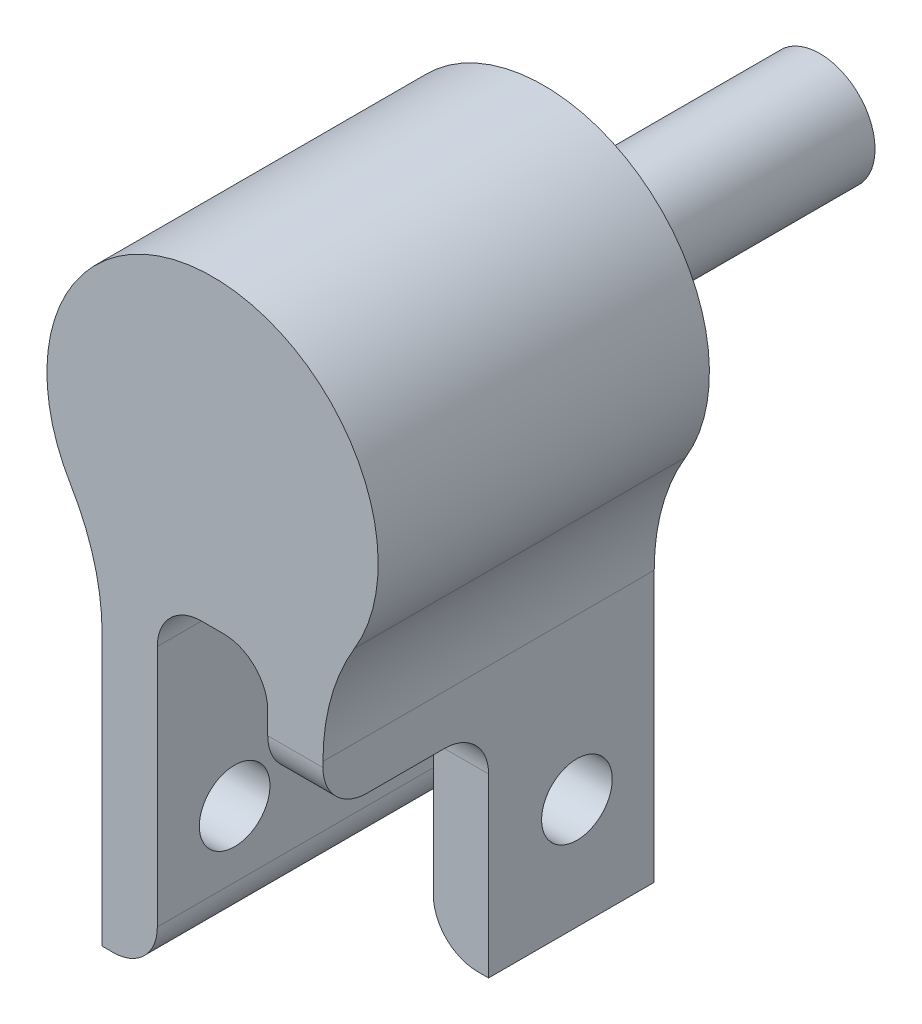
ISO-10303-21;
HEADER;
FILE_DESCRIPTION(('STEP AP214'),'2;1');
FILE_NAME('part.step','',(''),(''),'','','');
FILE_SCHEMA(('AUTOMOTIVE_DESIGN { 1 0 10303 214 1 1 1 1 }'));
ENDSEC;
DATA;
#1=APPLICATION_CONTEXT('core data for automotive mechanical design processes');
#2=APPLICATION_PROTOCOL_DEFINITION('international standard','automotive_design',2000,#1);
#3=PRODUCT_CONTEXT('',#1,'mechanical');
#4=PRODUCT('Part','Part','',(#3));
#5=PRODUCT_RELATED_PRODUCT_CATEGORY('part','',(#4));
#6=PRODUCT_DEFINITION_FORMATION('','',#4);
#7=PRODUCT_DEFINITION_CONTEXT('part definition',#1,'design');
#8=PRODUCT_DEFINITION('design','',#6,#7);
#9=PRODUCT_DEFINITION_SHAPE('','',#8);
#10=(LENGTH_UNIT() NAMED_UNIT(*) SI_UNIT(.MILLI.,.METRE.));
#11=(NAMED_UNIT(*) PLANE_ANGLE_UNIT() SI_UNIT($,.RADIAN.));
#12=(NAMED_UNIT(*) SI_UNIT($,.STERADIAN.) SOLID_ANGLE_UNIT());
#13=UNCERTAINTY_MEASURE_WITH_UNIT(LENGTH_MEASURE(1.E-05),#10,'distance_accuracy_value','');
#14=(GEOMETRIC_REPRESENTATION_CONTEXT(3) GLOBAL_UNCERTAINTY_ASSIGNED_CONTEXT((#13)) GLOBAL_UNIT_ASSIGNED_CONTEXT((#10,
#11,#12)) REPRESENTATION_CONTEXT('',''));
#15=CARTESIAN_POINT('',(0.,0.,0.));
#16=DIRECTION('',(0.,0.,1.));
#17=DIRECTION('',(1.,0.,0.));
#18=AXIS2_PLACEMENT_3D('',#15,#16,#17);
#19=CARTESIAN_POINT('',(-2.5,-6.2545654332996,15.));
#20=DIRECTION('',(0.,1.,0.));
#21=DIRECTION('',(0.,0.,1.));
#22=AXIS2_PLACEMENT_3D('',#19,#20,#21);
#23=PLANE('',#22);
#24=DIRECTION('',(1.,0.,0.));
#25=VECTOR('',#24,1.);
#26=CARTESIAN_POINT('',(-2.5,-6.2545654332996,0.));
#27=LINE('',#26,#25);
#28=CARTESIAN_POINT('',(-0.5,-6.2545654332996,0.));
#29=VERTEX_POINT('',#28);
#30=CARTESIAN_POINT('',(0.5,-6.2545654332996,0.));
#31=VERTEX_POINT('',#30);
#32=EDGE_CURVE('E351',#29,#31,#27,.T.);
#33=ORIENTED_EDGE('',*,*,#32,.T.);
#34=DIRECTION('',(0.,0.,-1.));
#35=VECTOR('',#34,1.);
#36=CARTESIAN_POINT('',(0.5,-6.2545654332996,15.));
#37=LINE('',#36,#35);
#38=CARTESIAN_POINT('',(0.5,-6.2545654332996,15.));
#39=VERTEX_POINT('',#38);
#40=EDGE_CURVE('E272',#31,#39,#37,.F.);
#41=ORIENTED_EDGE('',*,*,#40,.T.);
#42=DIRECTION('',(1.,0.,0.));
#43=VECTOR('',#42,1.);
#44=CARTESIAN_POINT('',(-2.5,-6.2545654332996,15.));
#45=LINE('',#44,#43);
#46=CARTESIAN_POINT('',(-0.5,-6.2545654332996,15.));
#47=VERTEX_POINT('',#46);
#48=EDGE_CURVE('E330',#47,#39,#45,.T.);
#49=ORIENTED_EDGE('',*,*,#48,.F.);
#50=DIRECTION('',(0.,0.,-1.));
#51=VECTOR('',#50,1.);
#52=CARTESIAN_POINT('',(-0.5,-6.2545654332996,0.));
#53=LINE('',#52,#51);
#54=EDGE_CURVE('E268',#47,#29,#53,.T.);
#55=ORIENTED_EDGE('',*,*,#54,.T.);
#56=EDGE_LOOP('',(#33,#41,#49,#55));
#57=FACE_BOUND('',#56,.T.);
#58=ADVANCED_FACE('F43',(#57),#23,.F.);
#59=CARTESIAN_POINT('',(2.5,-6.2545654332996,15.));
#60=DIRECTION('',(1.,0.,0.));
#61=DIRECTION('',(0.,1.,0.));
#62=AXIS2_PLACEMENT_3D('',#59,#60,#61);
#63=PLANE('',#62);
#64=CARTESIAN_POINT('',(2.5,-16.2545654332996,3.5));
#65=DIRECTION('',(1.,0.,0.));
#66=DIRECTION('',(0.,1.,0.));
#67=AXIS2_PLACEMENT_3D('',#64,#65,#66);
#68=CIRCLE('',#67,1.6);
#69=CARTESIAN_POINT('',(2.5,-14.6545654332996,3.5));
#70=VERTEX_POINT('',#69);
#71=EDGE_CURVE('E718',#70,#70,#68,.T.);
#72=ORIENTED_EDGE('',*,*,#71,.T.);
#73=EDGE_LOOP('',(#72));
#74=FACE_BOUND('',#73,.T.);
#75=DIRECTION('',(0.,0.,-1.));
#76=VECTOR('',#75,1.);
#77=CARTESIAN_POINT('',(2.5,-11.2545654332996,15.));
#78=LINE('',#77,#76);
#79=CARTESIAN_POINT('',(2.5,-11.2545654332996,13.));
#80=VERTEX_POINT('',#79);
#81=CARTESIAN_POINT('',(2.5,-11.2545654332996,9.5));
#82=VERTEX_POINT('',#81);
#83=EDGE_CURVE('E320',#80,#82,#78,.T.);
#84=ORIENTED_EDGE('',*,*,#83,.F.);
#85=CARTESIAN_POINT('',(2.5,-9.2545654332996,13.));
#86=DIRECTION('',(1.,0.,0.));
#87=DIRECTION('',(0.,1.,0.));
#88=AXIS2_PLACEMENT_3D('',#85,#86,#87);
#89=CIRCLE('',#88,2.);
#90=CARTESIAN_POINT('',(2.5,-9.2545654332996,15.));
#91=VERTEX_POINT('',#90);
#92=EDGE_CURVE('E309',#80,#91,#89,.F.);
#93=ORIENTED_EDGE('',*,*,#92,.T.);
#94=DIRECTION('',(0.,-1.,0.));
#95=VECTOR('',#94,1.);
#96=CARTESIAN_POINT('',(2.5,-6.2545654332996,15.));
#97=LINE('',#96,#95);
#98=CARTESIAN_POINT('',(2.5,-8.2545654332996,15.));
#99=VERTEX_POINT('',#98);
#100=EDGE_CURVE('E318',#99,#91,#97,.T.);
#101=ORIENTED_EDGE('',*,*,#100,.F.);
#102=DIRECTION('',(0.,0.,-1.));
#103=VECTOR('',#102,1.);
#104=CARTESIAN_POINT('',(2.5,-8.2545654332996,0.));
#105=LINE('',#104,#103);
#106=CARTESIAN_POINT('',(2.5,-8.2545654332996,0.));
#107=VERTEX_POINT('',#106);
#108=EDGE_CURVE('E245',#99,#107,#105,.T.);
#109=ORIENTED_EDGE('',*,*,#108,.T.);
#110=DIRECTION('',(0.,-1.,0.));
#111=VECTOR('',#110,1.);
#112=CARTESIAN_POINT('',(2.5,-6.2545654332996,0.));
#113=LINE('',#112,#111);
#114=CARTESIAN_POINT('',(2.5,-19.2545654332996,0.));
#115=VERTEX_POINT('',#114);
#116=EDGE_CURVE('E374',#107,#115,#113,.T.);
#117=ORIENTED_EDGE('',*,*,#116,.T.);
#118=DIRECTION('',(0.,0.,-1.));
#119=VECTOR('',#118,1.);
#120=CARTESIAN_POINT('',(2.5,-19.2545654332996,15.));
#121=LINE('',#120,#119);
#122=CARTESIAN_POINT('',(2.5,-19.2545654332996,7.5));
#123=VERTEX_POINT('',#122);
#124=EDGE_CURVE('E249',#115,#123,#121,.F.);
#125=ORIENTED_EDGE('',*,*,#124,.T.);
#126=DIRECTION('',(0.,-1.,0.));
#127=VECTOR('',#126,1.);
#128=CARTESIAN_POINT('',(2.5,-21.2545654332996,7.5));
#129=LINE('',#128,#127);
#130=CARTESIAN_POINT('',(2.5,-13.2545654332996,7.5));
#131=VERTEX_POINT('',#130);
#132=EDGE_CURVE('E340',#131,#123,#129,.T.);
#133=ORIENTED_EDGE('',*,*,#132,.F.);
#134=CARTESIAN_POINT('',(2.5,-13.2545654332996,9.5));
#135=DIRECTION('',(1.,0.,0.));
#136=DIRECTION('',(0.,1.,0.));
#137=AXIS2_PLACEMENT_3D('',#134,#135,#136);
#138=CIRCLE('',#137,2.);
#139=EDGE_CURVE('E11',#131,#82,#138,.T.);
#140=ORIENTED_EDGE('',*,*,#139,.T.);
#141=EDGE_LOOP('',(#84,#93,#101,#109,#117,#125,#133,#140));
#142=FACE_BOUND('',#141,.T.);
#143=ADVANCED_FACE('F317',(#74,#142),#63,.F.);
#144=CARTESIAN_POINT('',(2.5,-21.2545654332996,15.));
#145=DIRECTION('',(0.,1.,0.));
#146=DIRECTION('',(0.,0.,1.));
#147=AXIS2_PLACEMENT_3D('',#144,#145,#146);
#148=PLANE('',#147);
#149=DIRECTION('',(1.,0.,0.));
#150=VECTOR('',#149,1.);
#151=CARTESIAN_POINT('',(-7.501,-21.2545654332996,7.5));
#152=LINE('',#151,#150);
#153=CARTESIAN_POINT('',(4.5,-21.2545654332996,7.5));
#154=VERTEX_POINT('',#153);
#155=CARTESIAN_POINT('',(5.,-21.2545654332996,7.5));
#156=VERTEX_POINT('',#155);
#157=EDGE_CURVE('E167',#154,#156,#152,.T.);
#158=ORIENTED_EDGE('',*,*,#157,.F.);
#159=DIRECTION('',(0.,0.,-1.));
#160=VECTOR('',#159,1.);
#161=CARTESIAN_POINT('',(4.5,-21.2545654332996,15.));
#162=LINE('',#161,#160);
#163=CARTESIAN_POINT('',(4.5,-21.2545654332996,0.));
#164=VERTEX_POINT('',#163);
#165=EDGE_CURVE('E230',#154,#164,#162,.T.);
#166=ORIENTED_EDGE('',*,*,#165,.T.);
#167=DIRECTION('',(1.,0.,0.));
#168=VECTOR('',#167,1.);
#169=CARTESIAN_POINT('',(2.5,-21.2545654332996,0.));
#170=LINE('',#169,#168);
#171=CARTESIAN_POINT('',(5.,-21.2545654332996,0.));
#172=VERTEX_POINT('',#171);
#173=EDGE_CURVE('E193',#164,#172,#170,.T.);
#174=ORIENTED_EDGE('',*,*,#173,.T.);
#175=DIRECTION('',(0.,0.,-1.));
#176=VECTOR('',#175,1.);
#177=CARTESIAN_POINT('',(5.,-21.2545654332996,15.));
#178=LINE('',#177,#176);
#179=EDGE_CURVE('E185',#156,#172,#178,.T.);
#180=ORIENTED_EDGE('',*,*,#179,.F.);
#181=EDGE_LOOP('',(#158,#166,#174,#180));
#182=FACE_BOUND('',#181,.T.);
#183=ADVANCED_FACE('F191',(#182),#148,.F.);
#184=CARTESIAN_POINT('',(5.,-6.2545654332996,15.));
#185=DIRECTION('',(-1.,0.,0.));
#186=DIRECTION('',(0.,0.,1.));
#187=AXIS2_PLACEMENT_3D('',#184,#185,#186);
#188=PLANE('',#187);
#189=CARTESIAN_POINT('',(5.,-16.2545654332996,3.5));
#190=DIRECTION('',(-1.,0.,0.));
#191=DIRECTION('',(0.,0.,1.));
#192=AXIS2_PLACEMENT_3D('',#189,#190,#191);
#193=CIRCLE('',#192,1.6);
#194=CARTESIAN_POINT('',(5.,-16.2545654332996,5.1));
#195=VERTEX_POINT('',#194);
#196=EDGE_CURVE('E235',#195,#195,#193,.T.);
#197=ORIENTED_EDGE('',*,*,#196,.T.);
#198=EDGE_LOOP('',(#197));
#199=FACE_BOUND('',#198,.T.);
#200=DIRECTION('',(0.,1.,0.));
#201=VECTOR('',#200,1.);
#202=CARTESIAN_POINT('',(5.,-6.2545654332996,15.));
#203=LINE('',#202,#201);
#204=CARTESIAN_POINT('',(5.,-9.2545654332996,15.));
#205=VERTEX_POINT('',#204);
#206=CARTESIAN_POINT('',(5.,-9.01387818865998,15.));
#207=VERTEX_POINT('',#206);
#208=EDGE_CURVE('E329',#205,#207,#203,.T.);
#209=ORIENTED_EDGE('',*,*,#208,.F.);
#210=CARTESIAN_POINT('',(5.,-9.2545654332996,13.));
#211=DIRECTION('',(-1.,0.,0.));
#212=DIRECTION('',(0.,0.,1.));
#213=AXIS2_PLACEMENT_3D('',#210,#211,#212);
#214=CIRCLE('',#213,2.);
#215=CARTESIAN_POINT('',(5.,-11.2545654332996,13.));
#216=VERTEX_POINT('',#215);
#217=EDGE_CURVE('E299',#205,#216,#214,.F.);
#218=ORIENTED_EDGE('',*,*,#217,.T.);
#219=DIRECTION('',(0.,0.,1.));
#220=VECTOR('',#219,1.);
#221=CARTESIAN_POINT('',(5.,-11.2545654332996,15.));
#222=LINE('',#221,#220);
#223=CARTESIAN_POINT('',(5.,-11.2545654332996,9.5));
#224=VERTEX_POINT('',#223);
#225=EDGE_CURVE('E189',#224,#216,#222,.T.);
#226=ORIENTED_EDGE('',*,*,#225,.F.);
#227=CARTESIAN_POINT('',(5.,-13.2545654332996,9.5));
#228=DIRECTION('',(-1.,0.,0.));
#229=DIRECTION('',(0.,0.,1.));
#230=AXIS2_PLACEMENT_3D('',#227,#228,#229);
#231=CIRCLE('',#230,2.);
#232=CARTESIAN_POINT('',(5.,-13.2545654332996,7.5));
#233=VERTEX_POINT('',#232);
#234=EDGE_CURVE('E52',#224,#233,#231,.T.);
#235=ORIENTED_EDGE('',*,*,#234,.T.);
#236=DIRECTION('',(0.,1.,0.));
#237=VECTOR('',#236,1.);
#238=CARTESIAN_POINT('',(5.,-21.2545654332996,7.5));
#239=LINE('',#238,#237);
#240=EDGE_CURVE('E170',#156,#233,#239,.T.);
#241=ORIENTED_EDGE('',*,*,#240,.F.);
#242=ORIENTED_EDGE('',*,*,#179,.T.);
#243=DIRECTION('',(0.,1.,0.));
#244=VECTOR('',#243,1.);
#245=CARTESIAN_POINT('',(5.,-6.2545654332996,0.));
#246=LINE('',#245,#244);
#247=CARTESIAN_POINT('',(5.,-9.01387818865998,0.));
#248=VERTEX_POINT('',#247);
#249=EDGE_CURVE('E380',#172,#248,#246,.T.);
#250=ORIENTED_EDGE('',*,*,#249,.T.);
#251=DIRECTION('',(0.,0.,1.));
#252=VECTOR('',#251,1.);
#253=CARTESIAN_POINT('',(5.,-9.01387818865998,15.));
#254=LINE('',#253,#252);
#255=EDGE_CURVE('E210',#248,#207,#254,.T.);
#256=ORIENTED_EDGE('',*,*,#255,.T.);
#257=EDGE_LOOP('',(#209,#218,#226,#235,#241,#242,#250,#256));
#258=FACE_BOUND('',#257,.T.);
#259=ADVANCED_FACE('F183',(#199,#258),#188,.F.);
#260=CARTESIAN_POINT('',(0.,0.,15.));
#261=DIRECTION('',(0.,0.,-1.));
#262=DIRECTION('',(-1.,0.,0.));
#263=AXIS2_PLACEMENT_3D('',#260,#261,#262);
#264=CYLINDRICAL_SURFACE('',#263,7.5);
#265=CARTESIAN_POINT('',(0.,0.,15.));
#266=DIRECTION('',(0.,0.,1.));
#267=DIRECTION('',(1.,0.,0.));
#268=AXIS2_PLACEMENT_3D('',#265,#266,#267);
#269=CIRCLE('',#268,7.5);
#270=CARTESIAN_POINT('',(6.42857142857143,-3.86309065228285,15.));
#271=VERTEX_POINT('',#270);
#272=CARTESIAN_POINT('',(-6.42857142857143,-3.86309065228285,15.));
#273=VERTEX_POINT('',#272);
#274=EDGE_CURVE('E357',#271,#273,#269,.T.);
#275=ORIENTED_EDGE('',*,*,#274,.F.);
#276=DIRECTION('',(0.,0.,-1.));
#277=VECTOR('',#276,1.);
#278=CARTESIAN_POINT('',(6.42857142857143,-3.86309065228285,15.));
#279=LINE('',#278,#277);
#280=CARTESIAN_POINT('',(6.42857142857143,-3.86309065228285,0.));
#281=VERTEX_POINT('',#280);
#282=EDGE_CURVE('E200',#271,#281,#279,.T.);
#283=ORIENTED_EDGE('',*,*,#282,.T.);
#284=CARTESIAN_POINT('',(0.,0.,0.));
#285=DIRECTION('',(0.,0.,1.));
#286=DIRECTION('',(1.,0.,0.));
#287=AXIS2_PLACEMENT_3D('',#284,#285,#286);
#288=CIRCLE('',#287,7.5);
#289=CARTESIAN_POINT('',(-6.42857142857143,-3.86309065228285,0.));
#290=VERTEX_POINT('',#289);
#291=EDGE_CURVE('E383',#281,#290,#288,.T.);
#292=ORIENTED_EDGE('',*,*,#291,.T.);
#293=DIRECTION('',(0.,0.,-1.));
#294=VECTOR('',#293,1.);
#295=CARTESIAN_POINT('',(-6.42857142857143,-3.86309065228285,15.));
#296=LINE('',#295,#294);
#297=EDGE_CURVE('E195',#290,#273,#296,.F.);
#298=ORIENTED_EDGE('',*,*,#297,.T.);
#299=EDGE_LOOP('',(#275,#283,#292,#298));
#300=FACE_BOUND('',#299,.T.);
#301=ADVANCED_FACE('F489',(#300),#264,.T.);
#302=CARTESIAN_POINT('',(-5.,-6.2545654332996,15.));
#303=DIRECTION('',(1.,0.,0.));
#304=DIRECTION('',(0.,0.,-1.));
#305=AXIS2_PLACEMENT_3D('',#302,#303,#304);
#306=PLANE('',#305);
#307=CARTESIAN_POINT('',(-5.,-16.2545654332996,3.5));
#308=DIRECTION('',(-1.,0.,0.));
#309=DIRECTION('',(0.,0.,1.));
#310=AXIS2_PLACEMENT_3D('',#307,#308,#309);
#311=CIRCLE('',#310,1.6);
#312=CARTESIAN_POINT('',(-5.,-16.2545654332996,5.1));
#313=VERTEX_POINT('',#312);
#314=EDGE_CURVE('E236',#313,#313,#311,.T.);
#315=ORIENTED_EDGE('',*,*,#314,.F.);
#316=EDGE_LOOP('',(#315));
#317=FACE_BOUND('',#316,.T.);
#318=CARTESIAN_POINT('',(-5.,-16.2545654332996,11.5));
#319=DIRECTION('',(-1.,0.,0.));
#320=DIRECTION('',(0.,0.,1.));
#321=AXIS2_PLACEMENT_3D('',#318,#319,#320);
#322=CIRCLE('',#321,1.6);
#323=CARTESIAN_POINT('',(-5.,-16.2545654332996,13.1));
#324=VERTEX_POINT('',#323);
#325=EDGE_CURVE('E720',#324,#324,#322,.T.);
#326=ORIENTED_EDGE('',*,*,#325,.F.);
#327=EDGE_LOOP('',(#326));
#328=FACE_BOUND('',#327,.T.);
#329=DIRECTION('',(0.,-1.,0.));
#330=VECTOR('',#329,1.);
#331=CARTESIAN_POINT('',(-5.,-6.2545654332996,15.));
#332=LINE('',#331,#330);
#333=CARTESIAN_POINT('',(-5.,-9.01387818865998,15.));
#334=VERTEX_POINT('',#333);
#335=CARTESIAN_POINT('',(-5.,-21.2545654332996,15.));
#336=VERTEX_POINT('',#335);
#337=EDGE_CURVE('E361',#334,#336,#332,.T.);
#338=ORIENTED_EDGE('',*,*,#337,.F.);
#339=DIRECTION('',(0.,0.,1.));
#340=VECTOR('',#339,1.);
#341=CARTESIAN_POINT('',(-5.,-9.01387818865998,0.));
#342=LINE('',#341,#340);
#343=CARTESIAN_POINT('',(-5.,-9.01387818865998,0.));
#344=VERTEX_POINT('',#343);
#345=EDGE_CURVE('E214',#334,#344,#342,.F.);
#346=ORIENTED_EDGE('',*,*,#345,.T.);
#347=DIRECTION('',(0.,-1.,0.));
#348=VECTOR('',#347,1.);
#349=CARTESIAN_POINT('',(-5.,-6.2545654332996,0.));
#350=LINE('',#349,#348);
#351=CARTESIAN_POINT('',(-5.,-21.2545654332996,0.));
#352=VERTEX_POINT('',#351);
#353=EDGE_CURVE('E387',#344,#352,#350,.T.);
#354=ORIENTED_EDGE('',*,*,#353,.T.);
#355=DIRECTION('',(0.,0.,-1.));
#356=VECTOR('',#355,1.);
#357=CARTESIAN_POINT('',(-5.,-21.2545654332996,15.));
#358=LINE('',#357,#356);
#359=EDGE_CURVE('E196',#336,#352,#358,.T.);
#360=ORIENTED_EDGE('',*,*,#359,.F.);
#361=EDGE_LOOP('',(#338,#346,#354,#360));
#362=FACE_BOUND('',#361,.T.);
#363=ADVANCED_FACE('F485',(#317,#328,#362),#306,.F.);
#364=CARTESIAN_POINT('',(-5.,-21.2545654332996,15.));
#365=DIRECTION('',(0.,1.,0.));
#366=DIRECTION('',(0.,0.,1.));
#367=AXIS2_PLACEMENT_3D('',#364,#365,#366);
#368=PLANE('',#367);
#369=DIRECTION('',(1.,0.,0.));
#370=VECTOR('',#369,1.);
#371=CARTESIAN_POINT('',(-5.,-21.2545654332996,0.));
#372=LINE('',#371,#370);
#373=CARTESIAN_POINT('',(-4.5,-21.2545654332996,0.));
#374=VERTEX_POINT('',#373);
#375=EDGE_CURVE('E390',#352,#374,#372,.T.);
#376=ORIENTED_EDGE('',*,*,#375,.T.);
#377=DIRECTION('',(0.,0.,-1.));
#378=VECTOR('',#377,1.);
#379=CARTESIAN_POINT('',(-4.5,-21.2545654332996,15.));
#380=LINE('',#379,#378);
#381=CARTESIAN_POINT('',(-4.5,-21.2545654332996,15.));
#382=VERTEX_POINT('',#381);
#383=EDGE_CURVE('E262',#374,#382,#380,.F.);
#384=ORIENTED_EDGE('',*,*,#383,.T.);
#385=DIRECTION('',(1.,0.,0.));
#386=VECTOR('',#385,1.);
#387=CARTESIAN_POINT('',(-5.,-21.2545654332996,15.));
#388=LINE('',#387,#386);
#389=EDGE_CURVE('E364',#336,#382,#388,.T.);
#390=ORIENTED_EDGE('',*,*,#389,.F.);
#391=ORIENTED_EDGE('',*,*,#359,.T.);
#392=EDGE_LOOP('',(#376,#384,#390,#391));
#393=FACE_BOUND('',#392,.T.);
#394=ADVANCED_FACE('F481',(#393),#368,.F.);
#395=CARTESIAN_POINT('',(-2.5,-6.2545654332996,15.));
#396=DIRECTION('',(-1.,0.,0.));
#397=DIRECTION('',(0.,-1.,0.));
#398=AXIS2_PLACEMENT_3D('',#395,#396,#397);
#399=PLANE('',#398);
#400=CARTESIAN_POINT('',(-2.5,-16.2545654332996,3.5));
#401=DIRECTION('',(-1.,0.,0.));
#402=DIRECTION('',(0.,-1.,0.));
#403=AXIS2_PLACEMENT_3D('',#400,#401,#402);
#404=CIRCLE('',#403,1.6);
#405=CARTESIAN_POINT('',(-2.5,-17.8545654332996,3.5));
#406=VERTEX_POINT('',#405);
#407=EDGE_CURVE('E231',#406,#406,#404,.T.);
#408=ORIENTED_EDGE('',*,*,#407,.T.);
#409=EDGE_LOOP('',(#408));
#410=FACE_BOUND('',#409,.T.);
#411=CARTESIAN_POINT('',(-2.5,-16.2545654332996,11.5));
#412=DIRECTION('',(-1.,0.,0.));
#413=DIRECTION('',(0.,-1.,0.));
#414=AXIS2_PLACEMENT_3D('',#411,#412,#413);
#415=CIRCLE('',#414,1.6);
#416=CARTESIAN_POINT('',(-2.5,-17.8545654332996,11.5));
#417=VERTEX_POINT('',#416);
#418=EDGE_CURVE('E178',#417,#417,#415,.F.);
#419=ORIENTED_EDGE('',*,*,#418,.F.);
#420=EDGE_LOOP('',(#419));
#421=FACE_BOUND('',#420,.T.);
#422=DIRECTION('',(0.,1.,0.));
#423=VECTOR('',#422,1.);
#424=CARTESIAN_POINT('',(-2.5,-6.2545654332996,15.));
#425=LINE('',#424,#423);
#426=CARTESIAN_POINT('',(-2.5,-19.2545654332996,15.));
#427=VERTEX_POINT('',#426);
#428=CARTESIAN_POINT('',(-2.5,-8.2545654332996,15.));
#429=VERTEX_POINT('',#428);
#430=EDGE_CURVE('E203',#427,#429,#425,.T.);
#431=ORIENTED_EDGE('',*,*,#430,.F.);
#432=DIRECTION('',(0.,0.,-1.));
#433=VECTOR('',#432,1.);
#434=CARTESIAN_POINT('',(-2.5,-19.2545654332996,15.));
#435=LINE('',#434,#433);
#436=CARTESIAN_POINT('',(-2.5,-19.2545654332996,0.));
#437=VERTEX_POINT('',#436);
#438=EDGE_CURVE('E258',#427,#437,#435,.T.);
#439=ORIENTED_EDGE('',*,*,#438,.T.);
#440=DIRECTION('',(0.,1.,0.));
#441=VECTOR('',#440,1.);
#442=CARTESIAN_POINT('',(-2.5,-6.2545654332996,0.));
#443=LINE('',#442,#441);
#444=CARTESIAN_POINT('',(-2.5,-8.2545654332996,0.));
#445=VERTEX_POINT('',#444);
#446=EDGE_CURVE('E353',#437,#445,#443,.T.);
#447=ORIENTED_EDGE('',*,*,#446,.T.);
#448=DIRECTION('',(0.,0.,-1.));
#449=VECTOR('',#448,1.);
#450=CARTESIAN_POINT('',(-2.5,-8.2545654332996,15.));
#451=LINE('',#450,#449);
#452=EDGE_CURVE('E255',#445,#429,#451,.F.);
#453=ORIENTED_EDGE('',*,*,#452,.T.);
#454=EDGE_LOOP('',(#431,#439,#447,#453));
#455=FACE_BOUND('',#454,.T.);
#456=ADVANCED_FACE('F399',(#410,#421,#455),#399,.F.);
#457=CARTESIAN_POINT('',(0.,0.,15.));
#458=DIRECTION('',(0.,0.,1.));
#459=DIRECTION('',(1.,0.,0.));
#460=AXIS2_PLACEMENT_3D('',#457,#458,#459);
#461=PLANE('',#460);
#462=ORIENTED_EDGE('',*,*,#100,.T.);
#463=DIRECTION('',(1.,0.,0.));
#464=VECTOR('',#463,1.);
#465=CARTESIAN_POINT('',(5.,-9.2545654332996,15.));
#466=LINE('',#465,#464);
#467=EDGE_CURVE('E295',#91,#205,#466,.T.);
#468=ORIENTED_EDGE('',*,*,#467,.T.);
#469=ORIENTED_EDGE('',*,*,#208,.T.);
#470=CARTESIAN_POINT('',(15.,-9.01387818865998,15.));
#471=DIRECTION('',(0.,0.,1.));
#472=DIRECTION('',(1.,0.,0.));
#473=AXIS2_PLACEMENT_3D('',#470,#471,#472);
#474=CIRCLE('',#473,10.);
#475=EDGE_CURVE('E221',#207,#271,#474,.F.);
#476=ORIENTED_EDGE('',*,*,#475,.T.);
#477=ORIENTED_EDGE('',*,*,#274,.T.);
#478=CARTESIAN_POINT('',(-15.,-9.01387818865998,15.));
#479=DIRECTION('',(0.,0.,1.));
#480=DIRECTION('',(1.,0.,0.));
#481=AXIS2_PLACEMENT_3D('',#478,#479,#480);
#482=CIRCLE('',#481,10.);
#483=EDGE_CURVE('E227',#273,#334,#482,.F.);
#484=ORIENTED_EDGE('',*,*,#483,.T.);
#485=ORIENTED_EDGE('',*,*,#337,.T.);
#486=ORIENTED_EDGE('',*,*,#389,.T.);
#487=CARTESIAN_POINT('',(-4.5,-19.2545654332996,15.));
#488=DIRECTION('',(0.,0.,1.));
#489=DIRECTION('',(1.,0.,0.));
#490=AXIS2_PLACEMENT_3D('',#487,#488,#489);
#491=CIRCLE('',#490,2.);
#492=EDGE_CURVE('E265',#382,#427,#491,.T.);
#493=ORIENTED_EDGE('',*,*,#492,.T.);
#494=ORIENTED_EDGE('',*,*,#430,.T.);
#495=CARTESIAN_POINT('',(-0.5,-8.2545654332996,15.));
#496=DIRECTION('',(0.,0.,1.));
#497=DIRECTION('',(1.,0.,0.));
#498=AXIS2_PLACEMENT_3D('',#495,#496,#497);
#499=CIRCLE('',#498,2.);
#500=EDGE_CURVE('E284',#429,#47,#499,.F.);
#501=ORIENTED_EDGE('',*,*,#500,.T.);
#502=ORIENTED_EDGE('',*,*,#48,.T.);
#503=CARTESIAN_POINT('',(0.5,-8.2545654332996,15.));
#504=DIRECTION('',(0.,0.,1.));
#505=DIRECTION('',(1.,0.,0.));
#506=AXIS2_PLACEMENT_3D('',#503,#504,#505);
#507=CIRCLE('',#506,2.);
#508=EDGE_CURVE('E278',#39,#99,#507,.F.);
#509=ORIENTED_EDGE('',*,*,#508,.T.);
#510=EDGE_LOOP('',(#462,#468,#469,#476,#477,#484,#485,#486,#493,#494,#501,#502,#509));
#511=FACE_BOUND('',#510,.T.);
#512=ADVANCED_FACE('F325',(#511),#461,.T.);
#513=CARTESIAN_POINT('',(0.,0.,0.));
#514=DIRECTION('',(0.,0.,1.));
#515=DIRECTION('',(1.,0.,0.));
#516=AXIS2_PLACEMENT_3D('',#513,#514,#515);
#517=PLANE('',#516);
#518=CARTESIAN_POINT('',(0.,0.,0.));
#519=DIRECTION('',(0.,0.,1.));
#520=DIRECTION('',(1.,0.,0.));
#521=AXIS2_PLACEMENT_3D('',#518,#519,#520);
#522=CIRCLE('',#521,3.5);
#523=CARTESIAN_POINT('',(3.5,0.,0.));
#524=VERTEX_POINT('',#523);
#525=EDGE_CURVE('E291',#524,#524,#522,.T.);
#526=ORIENTED_EDGE('',*,*,#525,.T.);
#527=EDGE_LOOP('',(#526));
#528=FACE_BOUND('',#527,.T.);
#529=ORIENTED_EDGE('',*,*,#173,.F.);
#530=CARTESIAN_POINT('',(4.5,-19.2545654332996,0.));
#531=DIRECTION('',(0.,0.,1.));
#532=DIRECTION('',(1.,0.,0.));
#533=AXIS2_PLACEMENT_3D('',#530,#531,#532);
#534=CIRCLE('',#533,2.);
#535=EDGE_CURVE('E242',#164,#115,#534,.F.);
#536=ORIENTED_EDGE('',*,*,#535,.T.);
#537=ORIENTED_EDGE('',*,*,#116,.F.);
#538=CARTESIAN_POINT('',(0.5,-8.2545654332996,0.));
#539=DIRECTION('',(0.,0.,1.));
#540=DIRECTION('',(1.,0.,0.));
#541=AXIS2_PLACEMENT_3D('',#538,#539,#540);
#542=CIRCLE('',#541,2.);
#543=EDGE_CURVE('E275',#107,#31,#542,.T.);
#544=ORIENTED_EDGE('',*,*,#543,.T.);
#545=ORIENTED_EDGE('',*,*,#32,.F.);
#546=CARTESIAN_POINT('',(-0.5,-8.2545654332996,0.));
#547=DIRECTION('',(0.,0.,1.));
#548=DIRECTION('',(1.,0.,0.));
#549=AXIS2_PLACEMENT_3D('',#546,#547,#548);
#550=CIRCLE('',#549,2.);
#551=EDGE_CURVE('E281',#29,#445,#550,.T.);
#552=ORIENTED_EDGE('',*,*,#551,.T.);
#553=ORIENTED_EDGE('',*,*,#446,.F.);
#554=CARTESIAN_POINT('',(-4.5,-19.2545654332996,0.));
#555=DIRECTION('',(0.,0.,1.));
#556=DIRECTION('',(1.,0.,0.));
#557=AXIS2_PLACEMENT_3D('',#554,#555,#556);
#558=CIRCLE('',#557,2.);
#559=EDGE_CURVE('E239',#437,#374,#558,.F.);
#560=ORIENTED_EDGE('',*,*,#559,.T.);
#561=ORIENTED_EDGE('',*,*,#375,.F.);
#562=ORIENTED_EDGE('',*,*,#353,.F.);
#563=CARTESIAN_POINT('',(-15.,-9.01387818865998,0.));
#564=DIRECTION('',(0.,0.,1.));
#565=DIRECTION('',(1.,0.,0.));
#566=AXIS2_PLACEMENT_3D('',#563,#564,#565);
#567=CIRCLE('',#566,10.);
#568=EDGE_CURVE('E224',#344,#290,#567,.T.);
#569=ORIENTED_EDGE('',*,*,#568,.T.);
#570=ORIENTED_EDGE('',*,*,#291,.F.);
#571=CARTESIAN_POINT('',(15.,-9.01387818865998,0.));
#572=DIRECTION('',(0.,0.,1.));
#573=DIRECTION('',(1.,0.,0.));
#574=AXIS2_PLACEMENT_3D('',#571,#572,#573);
#575=CIRCLE('',#574,10.);
#576=EDGE_CURVE('E218',#281,#248,#575,.T.);
#577=ORIENTED_EDGE('',*,*,#576,.T.);
#578=ORIENTED_EDGE('',*,*,#249,.F.);
#579=EDGE_LOOP('',(#529,#536,#537,#544,#545,#552,#553,#560,#561,#562,#569,#570,#577,#578));
#580=FACE_BOUND('',#579,.T.);
#581=ADVANCED_FACE('F414',(#528,#580),#517,.F.);
#582=CARTESIAN_POINT('',(15.,-9.01387818865998,15.));
#583=DIRECTION('',(0.,0.,-1.));
#584=DIRECTION('',(-1.,0.,0.));
#585=AXIS2_PLACEMENT_3D('',#582,#583,#584);
#586=CYLINDRICAL_SURFACE('',#585,10.);
#587=ORIENTED_EDGE('',*,*,#475,.F.);
#588=ORIENTED_EDGE('',*,*,#255,.F.);
#589=ORIENTED_EDGE('',*,*,#576,.F.);
#590=ORIENTED_EDGE('',*,*,#282,.F.);
#591=EDGE_LOOP('',(#587,#588,#589,#590));
#592=FACE_BOUND('',#591,.T.);
#593=ADVANCED_FACE('F432',(#592),#586,.F.);
#594=CARTESIAN_POINT('',(-15.,-9.01387818865998,15.));
#595=DIRECTION('',(0.,0.,-1.));
#596=DIRECTION('',(-1.,0.,0.));
#597=AXIS2_PLACEMENT_3D('',#594,#595,#596);
#598=CYLINDRICAL_SURFACE('',#597,10.);
#599=ORIENTED_EDGE('',*,*,#483,.F.);
#600=ORIENTED_EDGE('',*,*,#297,.F.);
#601=ORIENTED_EDGE('',*,*,#568,.F.);
#602=ORIENTED_EDGE('',*,*,#345,.F.);
#603=EDGE_LOOP('',(#599,#600,#601,#602));
#604=FACE_BOUND('',#603,.T.);
#605=ADVANCED_FACE('F435',(#604),#598,.F.);
#606=CARTESIAN_POINT('',(0.,0.,-12.5));
#607=DIRECTION('',(0.,0.,1.));
#608=DIRECTION('',(1.,0.,0.));
#609=AXIS2_PLACEMENT_3D('',#606,#607,#608);
#610=CYLINDRICAL_SURFACE('',#609,2.5);
#611=CARTESIAN_POINT('',(0.,0.,-1.));
#612=DIRECTION('',(0.,0.,1.));
#613=DIRECTION('',(1.,0.,0.));
#614=AXIS2_PLACEMENT_3D('',#611,#612,#613);
#615=CIRCLE('',#614,2.5);
#616=CARTESIAN_POINT('',(2.5,0.,-1.));
#617=VERTEX_POINT('',#616);
#618=EDGE_CURVE('E287',#617,#617,#615,.F.);
#619=ORIENTED_EDGE('',*,*,#618,.T.);
#620=EDGE_LOOP('',(#619));
#621=FACE_BOUND('',#620,.T.);
#622=CARTESIAN_POINT('',(0.,0.,-12.5));
#623=DIRECTION('',(0.,0.,-1.));
#624=DIRECTION('',(-1.,0.,0.));
#625=AXIS2_PLACEMENT_3D('',#622,#623,#624);
#626=CIRCLE('',#625,2.5);
#627=CARTESIAN_POINT('',(-2.5,0.,-12.5));
#628=VERTEX_POINT('',#627);
#629=EDGE_CURVE('E346',#628,#628,#626,.T.);
#630=ORIENTED_EDGE('',*,*,#629,.F.);
#631=EDGE_LOOP('',(#630));
#632=FACE_BOUND('',#631,.T.);
#633=ADVANCED_FACE('F439',(#621,#632),#610,.T.);
#634=CARTESIAN_POINT('',(0.,0.,-12.5));
#635=DIRECTION('',(0.,0.,-1.));
#636=DIRECTION('',(-1.,0.,0.));
#637=AXIS2_PLACEMENT_3D('',#634,#635,#636);
#638=PLANE('',#637);
#639=ORIENTED_EDGE('',*,*,#629,.T.);
#640=EDGE_LOOP('',(#639));
#641=FACE_BOUND('',#640,.T.);
#642=ADVANCED_FACE('F462',(#641),#638,.T.);
#643=CARTESIAN_POINT('',(-7.501,-11.2545654332996,15.));
#644=DIRECTION('',(0.,1.,0.));
#645=DIRECTION('',(0.,0.,1.));
#646=AXIS2_PLACEMENT_3D('',#643,#644,#645);
#647=PLANE('',#646);
#648=ORIENTED_EDGE('',*,*,#225,.T.);
#649=DIRECTION('',(1.,0.,0.));
#650=VECTOR('',#649,1.);
#651=CARTESIAN_POINT('',(2.5,-11.2545654332996,13.));
#652=LINE('',#651,#650);
#653=EDGE_CURVE('E306',#216,#80,#652,.F.);
#654=ORIENTED_EDGE('',*,*,#653,.T.);
#655=ORIENTED_EDGE('',*,*,#83,.T.);
#656=DIRECTION('',(1.,0.,0.));
#657=VECTOR('',#656,1.);
#658=CARTESIAN_POINT('',(5.,-11.2545654332996,9.5));
#659=LINE('',#658,#657);
#660=EDGE_CURVE('E302',#82,#224,#659,.T.);
#661=ORIENTED_EDGE('',*,*,#660,.T.);
#662=EDGE_LOOP('',(#648,#654,#655,#661));
#663=FACE_BOUND('',#662,.T.);
#664=ADVANCED_FACE('F335',(#663),#647,.F.);
#665=CARTESIAN_POINT('',(-7.501,-21.2545654332996,7.5));
#666=DIRECTION('',(0.,0.,-1.));
#667=DIRECTION('',(-1.,0.,0.));
#668=AXIS2_PLACEMENT_3D('',#665,#666,#667);
#669=PLANE('',#668);
#670=ORIENTED_EDGE('',*,*,#240,.T.);
#671=DIRECTION('',(1.,0.,0.));
#672=VECTOR('',#671,1.);
#673=CARTESIAN_POINT('',(2.5,-13.2545654332996,7.5));
#674=LINE('',#673,#672);
#675=EDGE_CURVE('E59',#233,#131,#674,.F.);
#676=ORIENTED_EDGE('',*,*,#675,.T.);
#677=ORIENTED_EDGE('',*,*,#132,.T.);
#678=CARTESIAN_POINT('',(4.5,-19.2545654332996,7.5));
#679=DIRECTION('',(0.,0.,-1.));
#680=DIRECTION('',(-1.,0.,0.));
#681=AXIS2_PLACEMENT_3D('',#678,#679,#680);
#682=CIRCLE('',#681,2.);
#683=EDGE_CURVE('E172',#123,#154,#682,.F.);
#684=ORIENTED_EDGE('',*,*,#683,.T.);
#685=ORIENTED_EDGE('',*,*,#157,.T.);
#686=EDGE_LOOP('',(#670,#676,#677,#684,#685));
#687=FACE_BOUND('',#686,.T.);
#688=ADVANCED_FACE('F169',(#687),#669,.F.);
#689=CARTESIAN_POINT('',(7.501,-16.2545654332996,11.5));
#690=DIRECTION('',(-1.,0.,0.));
#691=DIRECTION('',(0.,0.,1.));
#692=AXIS2_PLACEMENT_3D('',#689,#690,#691);
#693=CYLINDRICAL_SURFACE('',#692,1.6);
#694=ORIENTED_EDGE('',*,*,#325,.T.);
#695=EDGE_LOOP('',(#694));
#696=FACE_BOUND('',#695,.T.);
#697=ORIENTED_EDGE('',*,*,#418,.T.);
#698=EDGE_LOOP('',(#697));
#699=FACE_BOUND('',#698,.T.);
#700=ADVANCED_FACE('F630',(#696,#699),#693,.F.);
#701=CARTESIAN_POINT('',(7.5,-16.2545654332996,3.5));
#702=DIRECTION('',(-1.,0.,0.));
#703=DIRECTION('',(0.,0.,1.));
#704=AXIS2_PLACEMENT_3D('',#701,#702,#703);
#705=CYLINDRICAL_SURFACE('',#704,1.6);
#706=ORIENTED_EDGE('',*,*,#314,.T.);
#707=EDGE_LOOP('',(#706));
#708=FACE_BOUND('',#707,.T.);
#709=ORIENTED_EDGE('',*,*,#407,.F.);
#710=EDGE_LOOP('',(#709));
#711=FACE_BOUND('',#710,.T.);
#712=ADVANCED_FACE('F638',(#708,#711),#705,.F.);
#713=ORIENTED_EDGE('',*,*,#196,.F.);
#714=EDGE_LOOP('',(#713));
#715=FACE_BOUND('',#714,.T.);
#716=ORIENTED_EDGE('',*,*,#71,.F.);
#717=EDGE_LOOP('',(#716));
#718=FACE_BOUND('',#717,.T.);
#719=ADVANCED_FACE('F444',(#715,#718),#705,.F.);
#720=CARTESIAN_POINT('',(4.5,-19.2545654332996,15.));
#721=DIRECTION('',(0.,0.,-1.));
#722=DIRECTION('',(-1.,0.,0.));
#723=AXIS2_PLACEMENT_3D('',#720,#721,#722);
#724=CYLINDRICAL_SURFACE('',#723,2.);
#725=ORIENTED_EDGE('',*,*,#683,.F.);
#726=ORIENTED_EDGE('',*,*,#124,.F.);
#727=ORIENTED_EDGE('',*,*,#535,.F.);
#728=ORIENTED_EDGE('',*,*,#165,.F.);
#729=EDGE_LOOP('',(#725,#726,#727,#728));
#730=FACE_BOUND('',#729,.T.);
#731=ADVANCED_FACE('F416',(#730),#724,.T.);
#732=CARTESIAN_POINT('',(-4.5,-19.2545654332996,15.));
#733=DIRECTION('',(0.,0.,-1.));
#734=DIRECTION('',(-1.,0.,0.));
#735=AXIS2_PLACEMENT_3D('',#732,#733,#734);
#736=CYLINDRICAL_SURFACE('',#735,2.);
#737=ORIENTED_EDGE('',*,*,#492,.F.);
#738=ORIENTED_EDGE('',*,*,#383,.F.);
#739=ORIENTED_EDGE('',*,*,#559,.F.);
#740=ORIENTED_EDGE('',*,*,#438,.F.);
#741=EDGE_LOOP('',(#737,#738,#739,#740));
#742=FACE_BOUND('',#741,.T.);
#743=ADVANCED_FACE('F443',(#742),#736,.T.);
#744=CARTESIAN_POINT('',(0.5,-8.2545654332996,15.));
#745=DIRECTION('',(0.,0.,1.));
#746=DIRECTION('',(1.,0.,0.));
#747=AXIS2_PLACEMENT_3D('',#744,#745,#746);
#748=CYLINDRICAL_SURFACE('',#747,2.);
#749=ORIENTED_EDGE('',*,*,#508,.F.);
#750=ORIENTED_EDGE('',*,*,#40,.F.);
#751=ORIENTED_EDGE('',*,*,#543,.F.);
#752=ORIENTED_EDGE('',*,*,#108,.F.);
#753=EDGE_LOOP('',(#749,#750,#751,#752));
#754=FACE_BOUND('',#753,.T.);
#755=ADVANCED_FACE('F411',(#754),#748,.F.);
#756=CARTESIAN_POINT('',(-0.5,-8.2545654332996,15.));
#757=DIRECTION('',(0.,0.,1.));
#758=DIRECTION('',(1.,0.,0.));
#759=AXIS2_PLACEMENT_3D('',#756,#757,#758);
#760=CYLINDRICAL_SURFACE('',#759,2.);
#761=ORIENTED_EDGE('',*,*,#500,.F.);
#762=ORIENTED_EDGE('',*,*,#452,.F.);
#763=ORIENTED_EDGE('',*,*,#551,.F.);
#764=ORIENTED_EDGE('',*,*,#54,.F.);
#765=EDGE_LOOP('',(#761,#762,#763,#764));
#766=FACE_BOUND('',#765,.T.);
#767=ADVANCED_FACE('F404',(#766),#760,.F.);
#768=CARTESIAN_POINT('',(0.,0.,-1.));
#769=DIRECTION('',(0.,0.,1.));
#770=DIRECTION('',(1.,0.,0.));
#771=AXIS2_PLACEMENT_3D('',#768,#769,#770);
#772=TOROIDAL_SURFACE('',#771,3.5,1.);
#773=ORIENTED_EDGE('',*,*,#525,.F.);
#774=EDGE_LOOP('',(#773));
#775=FACE_BOUND('',#774,.T.);
#776=ORIENTED_EDGE('',*,*,#618,.F.);
#777=EDGE_LOOP('',(#776));
#778=FACE_BOUND('',#777,.T.);
#779=ADVANCED_FACE('F422',(#775,#778),#772,.F.);
#780=CARTESIAN_POINT('',(0.,-9.2545654332996,13.));
#781=DIRECTION('',(-1.,0.,0.));
#782=DIRECTION('',(0.,0.,1.));
#783=AXIS2_PLACEMENT_3D('',#780,#781,#782);
#784=CYLINDRICAL_SURFACE('',#783,2.);
#785=ORIENTED_EDGE('',*,*,#92,.F.);
#786=ORIENTED_EDGE('',*,*,#653,.F.);
#787=ORIENTED_EDGE('',*,*,#217,.F.);
#788=ORIENTED_EDGE('',*,*,#467,.F.);
#789=EDGE_LOOP('',(#785,#786,#787,#788));
#790=FACE_BOUND('',#789,.T.);
#791=ADVANCED_FACE('F332',(#790),#784,.T.);
#792=CARTESIAN_POINT('',(-7.501,-13.2545654332996,9.5));
#793=DIRECTION('',(-1.,0.,0.));
#794=DIRECTION('',(0.,0.,1.));
#795=AXIS2_PLACEMENT_3D('',#792,#793,#794);
#796=CYLINDRICAL_SURFACE('',#795,2.);
#797=ORIENTED_EDGE('',*,*,#139,.F.);
#798=ORIENTED_EDGE('',*,*,#675,.F.);
#799=ORIENTED_EDGE('',*,*,#234,.F.);
#800=ORIENTED_EDGE('',*,*,#660,.F.);
#801=EDGE_LOOP('',(#797,#798,#799,#800));
#802=FACE_BOUND('',#801,.T.);
#803=ADVANCED_FACE('F45',(#802),#796,.F.);
#804=CLOSED_SHELL('',(#58,#143,#183,#259,#301,#363,#394,#456,#512,#581,#593,#605,#633,#642,#664,
#688,#700,#712,#719,#731,#743,#755,#767,#779,#791,#803));
#805=MANIFOLD_SOLID_BREP('B2',#804);
#806=ADVANCED_BREP_SHAPE_REPRESENTATION('',(#18,#805),#14);
#807=SHAPE_DEFINITION_REPRESENTATION(#9,#806);
ENDSEC;
END-ISO-10303-21;
